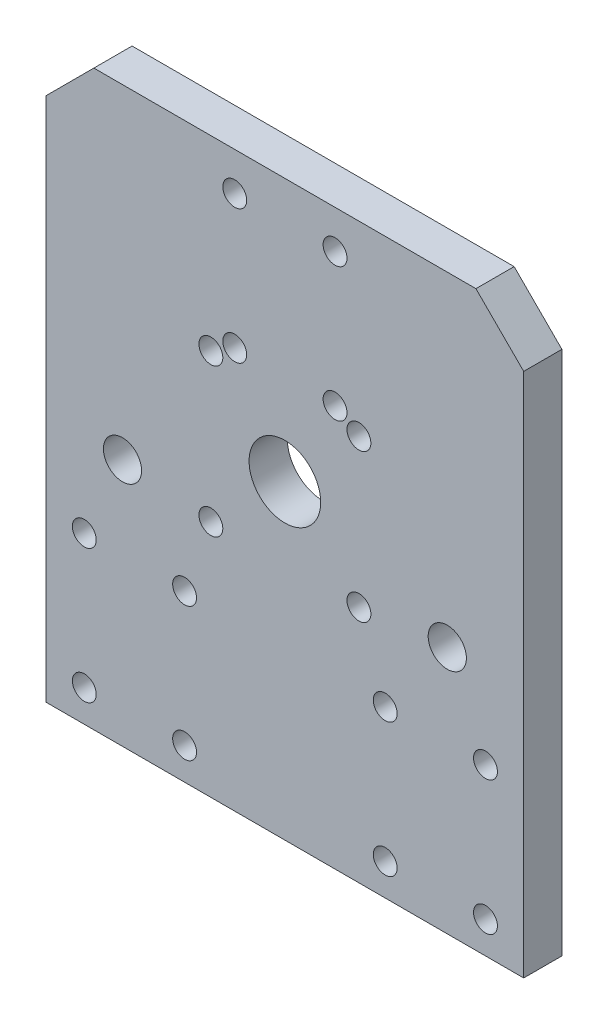
ISO-10303-21;
HEADER;
FILE_DESCRIPTION(('STEP AP214'),'2;1');
FILE_NAME('part.step','',(''),(''),'','','');
FILE_SCHEMA(('AUTOMOTIVE_DESIGN { 1 0 10303 214 1 1 1 1 }'));
ENDSEC;
DATA;
#1=APPLICATION_CONTEXT('core data for automotive mechanical design processes');
#2=APPLICATION_PROTOCOL_DEFINITION('international standard','automotive_design',2000,#1);
#3=PRODUCT_CONTEXT('',#1,'mechanical');
#4=PRODUCT('Part','Part','',(#3));
#5=PRODUCT_RELATED_PRODUCT_CATEGORY('part','',(#4));
#6=PRODUCT_DEFINITION_FORMATION('','',#4);
#7=PRODUCT_DEFINITION_CONTEXT('part definition',#1,'design');
#8=PRODUCT_DEFINITION('design','',#6,#7);
#9=PRODUCT_DEFINITION_SHAPE('','',#8);
#10=(LENGTH_UNIT() NAMED_UNIT(*) SI_UNIT(.MILLI.,.METRE.));
#11=(NAMED_UNIT(*) PLANE_ANGLE_UNIT() SI_UNIT($,.RADIAN.));
#12=(NAMED_UNIT(*) SI_UNIT($,.STERADIAN.) SOLID_ANGLE_UNIT());
#13=UNCERTAINTY_MEASURE_WITH_UNIT(LENGTH_MEASURE(1.E-05),#10,'distance_accuracy_value','');
#14=(GEOMETRIC_REPRESENTATION_CONTEXT(3) GLOBAL_UNCERTAINTY_ASSIGNED_CONTEXT((#13)) GLOBAL_UNIT_ASSIGNED_CONTEXT((#10,
#11,#12)) REPRESENTATION_CONTEXT('',''));
#15=CARTESIAN_POINT('',(0.,0.,0.));
#16=DIRECTION('',(0.,0.,1.));
#17=DIRECTION('',(1.,0.,0.));
#18=AXIS2_PLACEMENT_3D('',#15,#16,#17);
#19=CARTESIAN_POINT('',(0.,0.,4.));
#20=DIRECTION('',(0.,0.,-1.));
#21=DIRECTION('',(-1.,0.,0.));
#22=AXIS2_PLACEMENT_3D('',#19,#20,#21);
#23=PLANE('',#22);
#24=CARTESIAN_POINT('',(34.,51.98,4.));
#25=DIRECTION('',(0.,0.,1.));
#26=DIRECTION('',(1.,0.,0.));
#27=AXIS2_PLACEMENT_3D('',#24,#25,#26);
#28=CIRCLE('',#27,4.);
#29=CARTESIAN_POINT('',(38.,51.98,4.));
#30=VERTEX_POINT('',#29);
#31=EDGE_CURVE('E294',#30,#30,#28,.T.);
#32=ORIENTED_EDGE('',*,*,#31,.F.);
#33=EDGE_LOOP('',(#32));
#34=FACE_BOUND('',#33,.T.);
#35=CARTESIAN_POINT('',(-15.5,49.98,4.));
#36=DIRECTION('',(0.,0.,1.));
#37=DIRECTION('',(1.,0.,0.));
#38=AXIS2_PLACEMENT_3D('',#35,#36,#37);
#39=CIRCLE('',#38,2.5);
#40=CARTESIAN_POINT('',(-13.,49.98,4.));
#41=VERTEX_POINT('',#40);
#42=EDGE_CURVE('E286',#41,#41,#39,.T.);
#43=ORIENTED_EDGE('',*,*,#42,.F.);
#44=EDGE_LOOP('',(#43));
#45=FACE_BOUND('',#44,.T.);
#46=CARTESIAN_POINT('',(15.5,80.98,4.));
#47=DIRECTION('',(0.,0.,1.));
#48=DIRECTION('',(1.,0.,0.));
#49=AXIS2_PLACEMENT_3D('',#46,#47,#48);
#50=CIRCLE('',#49,2.5);
#51=CARTESIAN_POINT('',(18.,80.98,4.));
#52=VERTEX_POINT('',#51);
#53=EDGE_CURVE('E303',#52,#52,#50,.T.);
#54=ORIENTED_EDGE('',*,*,#53,.F.);
#55=EDGE_LOOP('',(#54));
#56=FACE_BOUND('',#55,.T.);
#57=CARTESIAN_POINT('',(15.5,49.98,4.));
#58=DIRECTION('',(0.,0.,1.));
#59=DIRECTION('',(1.,0.,0.));
#60=AXIS2_PLACEMENT_3D('',#57,#58,#59);
#61=CIRCLE('',#60,2.5);
#62=CARTESIAN_POINT('',(18.,49.98,4.));
#63=VERTEX_POINT('',#62);
#64=EDGE_CURVE('E304',#63,#63,#61,.T.);
#65=ORIENTED_EDGE('',*,*,#64,.F.);
#66=EDGE_LOOP('',(#65));
#67=FACE_BOUND('',#66,.T.);
#68=CARTESIAN_POINT('',(-34.,51.98,4.));
#69=DIRECTION('',(0.,0.,1.));
#70=DIRECTION('',(1.,0.,0.));
#71=AXIS2_PLACEMENT_3D('',#68,#69,#70);
#72=CIRCLE('',#71,4.);
#73=CARTESIAN_POINT('',(-30.,51.98,4.));
#74=VERTEX_POINT('',#73);
#75=EDGE_CURVE('E318',#74,#74,#72,.T.);
#76=ORIENTED_EDGE('',*,*,#75,.F.);
#77=EDGE_LOOP('',(#76));
#78=FACE_BOUND('',#77,.T.);
#79=CARTESIAN_POINT('',(-15.5,80.98,4.));
#80=DIRECTION('',(0.,0.,1.));
#81=DIRECTION('',(1.,0.,0.));
#82=AXIS2_PLACEMENT_3D('',#79,#80,#81);
#83=CIRCLE('',#82,2.5);
#84=CARTESIAN_POINT('',(-13.,80.98,4.));
#85=VERTEX_POINT('',#84);
#86=EDGE_CURVE('E282',#85,#85,#83,.T.);
#87=ORIENTED_EDGE('',*,*,#86,.F.);
#88=EDGE_LOOP('',(#87));
#89=FACE_BOUND('',#88,.T.);
#90=DIRECTION('',(0.,1.,0.));
#91=VECTOR('',#90,1.);
#92=CARTESIAN_POINT('',(50.,0.,4.));
#93=LINE('',#92,#91);
#94=CARTESIAN_POINT('',(50.,0.,4.));
#95=VERTEX_POINT('',#94);
#96=CARTESIAN_POINT('',(50.,110.,4.));
#97=VERTEX_POINT('',#96);
#98=EDGE_CURVE('E118',#95,#97,#93,.T.);
#99=ORIENTED_EDGE('',*,*,#98,.T.);
#100=DIRECTION('',(0.707106781186546,-0.707106781186549,0.));
#101=VECTOR('',#100,1.);
#102=CARTESIAN_POINT('',(40.,120.,4.));
#103=LINE('',#102,#101);
#104=CARTESIAN_POINT('',(40.,120.,4.));
#105=VERTEX_POINT('',#104);
#106=EDGE_CURVE('E55',#97,#105,#103,.F.);
#107=ORIENTED_EDGE('',*,*,#106,.T.);
#108=DIRECTION('',(-1.,0.,0.));
#109=VECTOR('',#108,1.);
#110=CARTESIAN_POINT('',(-50.,120.,4.));
#111=LINE('',#110,#109);
#112=CARTESIAN_POINT('',(-40.,120.,4.));
#113=VERTEX_POINT('',#112);
#114=EDGE_CURVE('E131',#105,#113,#111,.T.);
#115=ORIENTED_EDGE('',*,*,#114,.T.);
#116=DIRECTION('',(0.707106781186549,0.707106781186547,0.));
#117=VECTOR('',#116,1.);
#118=CARTESIAN_POINT('',(-50.,110.,4.));
#119=LINE('',#118,#117);
#120=CARTESIAN_POINT('',(-50.,110.,4.));
#121=VERTEX_POINT('',#120);
#122=EDGE_CURVE('E62',#113,#121,#119,.F.);
#123=ORIENTED_EDGE('',*,*,#122,.T.);
#124=DIRECTION('',(0.,-1.,0.));
#125=VECTOR('',#124,1.);
#126=CARTESIAN_POINT('',(-50.,0.,4.));
#127=LINE('',#126,#125);
#128=CARTESIAN_POINT('',(-50.,0.,4.));
#129=VERTEX_POINT('',#128);
#130=EDGE_CURVE('E100',#121,#129,#127,.T.);
#131=ORIENTED_EDGE('',*,*,#130,.T.);
#132=DIRECTION('',(1.,0.,0.));
#133=VECTOR('',#132,1.);
#134=CARTESIAN_POINT('',(50.,0.,4.));
#135=LINE('',#134,#133);
#136=EDGE_CURVE('E103',#129,#95,#135,.T.);
#137=ORIENTED_EDGE('',*,*,#136,.T.);
#138=EDGE_LOOP('',(#99,#107,#115,#123,#131,#137));
#139=FACE_BOUND('',#138,.T.);
#140=CARTESIAN_POINT('',(-42.,6.66986634029465,4.));
#141=DIRECTION('',(0.,0.,1.));
#142=DIRECTION('',(1.,0.,0.));
#143=AXIS2_PLACEMENT_3D('',#140,#141,#142);
#144=CIRCLE('',#143,2.5);
#145=CARTESIAN_POINT('',(-39.5,6.66986634029465,4.));
#146=VERTEX_POINT('',#145);
#147=EDGE_CURVE('E174',#146,#146,#144,.T.);
#148=ORIENTED_EDGE('',*,*,#147,.F.);
#149=EDGE_LOOP('',(#148));
#150=FACE_BOUND('',#149,.T.);
#151=CARTESIAN_POINT('',(-21.,6.66986634029465,4.));
#152=DIRECTION('',(0.,0.,1.));
#153=DIRECTION('',(1.,0.,0.));
#154=AXIS2_PLACEMENT_3D('',#151,#152,#153);
#155=CIRCLE('',#154,2.5);
#156=CARTESIAN_POINT('',(-18.5,6.66986634029465,4.));
#157=VERTEX_POINT('',#156);
#158=EDGE_CURVE('E182',#157,#157,#155,.T.);
#159=ORIENTED_EDGE('',*,*,#158,.F.);
#160=EDGE_LOOP('',(#159));
#161=FACE_BOUND('',#160,.T.);
#162=CARTESIAN_POINT('',(-42.,34.6698663402946,4.));
#163=DIRECTION('',(0.,0.,1.));
#164=DIRECTION('',(1.,0.,0.));
#165=AXIS2_PLACEMENT_3D('',#162,#163,#164);
#166=CIRCLE('',#165,2.5);
#167=CARTESIAN_POINT('',(-39.5,34.6698663402946,4.));
#168=VERTEX_POINT('',#167);
#169=EDGE_CURVE('E190',#168,#168,#166,.T.);
#170=ORIENTED_EDGE('',*,*,#169,.F.);
#171=EDGE_LOOP('',(#170));
#172=FACE_BOUND('',#171,.T.);
#173=CARTESIAN_POINT('',(-21.,34.6698663402946,4.));
#174=DIRECTION('',(0.,0.,1.));
#175=DIRECTION('',(1.,0.,0.));
#176=AXIS2_PLACEMENT_3D('',#173,#174,#175);
#177=CIRCLE('',#176,2.5);
#178=CARTESIAN_POINT('',(-18.5,34.6698663402946,4.));
#179=VERTEX_POINT('',#178);
#180=EDGE_CURVE('E198',#179,#179,#177,.T.);
#181=ORIENTED_EDGE('',*,*,#180,.F.);
#182=EDGE_LOOP('',(#181));
#183=FACE_BOUND('',#182,.T.);
#184=CARTESIAN_POINT('',(-10.5,112.,4.));
#185=DIRECTION('',(0.,0.,1.));
#186=DIRECTION('',(1.,0.,0.));
#187=AXIS2_PLACEMENT_3D('',#184,#185,#186);
#188=CIRCLE('',#187,2.5);
#189=CARTESIAN_POINT('',(-8.00000000000001,112.,4.));
#190=VERTEX_POINT('',#189);
#191=EDGE_CURVE('E206',#190,#190,#188,.T.);
#192=ORIENTED_EDGE('',*,*,#191,.F.);
#193=EDGE_LOOP('',(#192));
#194=FACE_BOUND('',#193,.T.);
#195=CARTESIAN_POINT('',(-10.5,84.,4.));
#196=DIRECTION('',(0.,0.,1.));
#197=DIRECTION('',(1.,0.,0.));
#198=AXIS2_PLACEMENT_3D('',#195,#196,#197);
#199=CIRCLE('',#198,2.5);
#200=CARTESIAN_POINT('',(-8.00000000000001,84.,4.));
#201=VERTEX_POINT('',#200);
#202=EDGE_CURVE('E214',#201,#201,#199,.T.);
#203=ORIENTED_EDGE('',*,*,#202,.F.);
#204=EDGE_LOOP('',(#203));
#205=FACE_BOUND('',#204,.T.);
#206=CARTESIAN_POINT('',(10.5,84.,4.));
#207=DIRECTION('',(0.,0.,1.));
#208=DIRECTION('',(-1.,0.,0.));
#209=AXIS2_PLACEMENT_3D('',#206,#207,#208);
#210=CIRCLE('',#209,2.5);
#211=CARTESIAN_POINT('',(8.00000000000001,84.,4.));
#212=VERTEX_POINT('',#211);
#213=EDGE_CURVE('E222',#212,#212,#210,.T.);
#214=ORIENTED_EDGE('',*,*,#213,.F.);
#215=EDGE_LOOP('',(#214));
#216=FACE_BOUND('',#215,.T.);
#217=CARTESIAN_POINT('',(10.5,112.,4.));
#218=DIRECTION('',(0.,0.,1.));
#219=DIRECTION('',(-1.,0.,0.));
#220=AXIS2_PLACEMENT_3D('',#217,#218,#219);
#221=CIRCLE('',#220,2.5);
#222=CARTESIAN_POINT('',(8.00000000000001,112.,4.));
#223=VERTEX_POINT('',#222);
#224=EDGE_CURVE('E230',#223,#223,#221,.T.);
#225=ORIENTED_EDGE('',*,*,#224,.F.);
#226=EDGE_LOOP('',(#225));
#227=FACE_BOUND('',#226,.T.);
#228=CARTESIAN_POINT('',(21.,34.6698663402946,4.));
#229=DIRECTION('',(0.,0.,1.));
#230=DIRECTION('',(-1.,0.,0.));
#231=AXIS2_PLACEMENT_3D('',#228,#229,#230);
#232=CIRCLE('',#231,2.5);
#233=CARTESIAN_POINT('',(18.5,34.6698663402946,4.));
#234=VERTEX_POINT('',#233);
#235=EDGE_CURVE('E238',#234,#234,#232,.T.);
#236=ORIENTED_EDGE('',*,*,#235,.F.);
#237=EDGE_LOOP('',(#236));
#238=FACE_BOUND('',#237,.T.);
#239=CARTESIAN_POINT('',(42.,34.6698663402946,4.));
#240=DIRECTION('',(0.,0.,1.));
#241=DIRECTION('',(-1.,0.,0.));
#242=AXIS2_PLACEMENT_3D('',#239,#240,#241);
#243=CIRCLE('',#242,2.5);
#244=CARTESIAN_POINT('',(39.5,34.6698663402946,4.));
#245=VERTEX_POINT('',#244);
#246=EDGE_CURVE('E246',#245,#245,#243,.T.);
#247=ORIENTED_EDGE('',*,*,#246,.F.);
#248=EDGE_LOOP('',(#247));
#249=FACE_BOUND('',#248,.T.);
#250=CARTESIAN_POINT('',(21.,6.66986634029465,4.));
#251=DIRECTION('',(0.,0.,1.));
#252=DIRECTION('',(-1.,0.,0.));
#253=AXIS2_PLACEMENT_3D('',#250,#251,#252);
#254=CIRCLE('',#253,2.5);
#255=CARTESIAN_POINT('',(18.5,6.66986634029465,4.));
#256=VERTEX_POINT('',#255);
#257=EDGE_CURVE('E254',#256,#256,#254,.T.);
#258=ORIENTED_EDGE('',*,*,#257,.F.);
#259=EDGE_LOOP('',(#258));
#260=FACE_BOUND('',#259,.T.);
#261=CARTESIAN_POINT('',(42.,6.66986634029465,4.));
#262=DIRECTION('',(0.,0.,1.));
#263=DIRECTION('',(-1.,0.,0.));
#264=AXIS2_PLACEMENT_3D('',#261,#262,#263);
#265=CIRCLE('',#264,2.5);
#266=CARTESIAN_POINT('',(39.5,6.66986634029465,4.));
#267=VERTEX_POINT('',#266);
#268=EDGE_CURVE('E262',#267,#267,#265,.T.);
#269=ORIENTED_EDGE('',*,*,#268,.F.);
#270=EDGE_LOOP('',(#269));
#271=FACE_BOUND('',#270,.T.);
#272=CARTESIAN_POINT('',(0.,64.9999999999999,4.));
#273=DIRECTION('',(0.,0.,1.));
#274=DIRECTION('',(1.,0.,0.));
#275=AXIS2_PLACEMENT_3D('',#272,#273,#274);
#276=CIRCLE('',#275,7.50000000000001);
#277=CARTESIAN_POINT('',(7.50000000000001,64.9999999999999,4.));
#278=VERTEX_POINT('',#277);
#279=EDGE_CURVE('E270',#278,#278,#276,.T.);
#280=ORIENTED_EDGE('',*,*,#279,.F.);
#281=EDGE_LOOP('',(#280));
#282=FACE_BOUND('',#281,.T.);
#283=ADVANCED_FACE('F45',(#34,#45,#56,#67,#78,#89,#139,#150,#161,#172,#183,#194,#205,#216,#227,
#238,#249,#260,#271,#282),#23,.F.);
#284=CARTESIAN_POINT('',(0.,0.,-4.));
#285=DIRECTION('',(0.,0.,-1.));
#286=DIRECTION('',(-1.,0.,0.));
#287=AXIS2_PLACEMENT_3D('',#284,#285,#286);
#288=PLANE('',#287);
#289=CARTESIAN_POINT('',(34.,51.98,-4.));
#290=DIRECTION('',(0.,0.,1.));
#291=DIRECTION('',(1.,0.,0.));
#292=AXIS2_PLACEMENT_3D('',#289,#290,#291);
#293=CIRCLE('',#292,4.);
#294=CARTESIAN_POINT('',(38.,51.98,-4.));
#295=VERTEX_POINT('',#294);
#296=EDGE_CURVE('E290',#295,#295,#293,.T.);
#297=ORIENTED_EDGE('',*,*,#296,.T.);
#298=EDGE_LOOP('',(#297));
#299=FACE_BOUND('',#298,.T.);
#300=CARTESIAN_POINT('',(-15.5,49.98,-4.));
#301=DIRECTION('',(0.,0.,1.));
#302=DIRECTION('',(1.,0.,0.));
#303=AXIS2_PLACEMENT_3D('',#300,#301,#302);
#304=CIRCLE('',#303,2.5);
#305=CARTESIAN_POINT('',(-13.,49.98,-4.));
#306=VERTEX_POINT('',#305);
#307=EDGE_CURVE('E308',#306,#306,#304,.T.);
#308=ORIENTED_EDGE('',*,*,#307,.T.);
#309=EDGE_LOOP('',(#308));
#310=FACE_BOUND('',#309,.T.);
#311=CARTESIAN_POINT('',(15.5,80.98,-4.));
#312=DIRECTION('',(0.,0.,1.));
#313=DIRECTION('',(1.,0.,0.));
#314=AXIS2_PLACEMENT_3D('',#311,#312,#313);
#315=CIRCLE('',#314,2.5);
#316=CARTESIAN_POINT('',(18.,80.98,-4.));
#317=VERTEX_POINT('',#316);
#318=EDGE_CURVE('E299',#317,#317,#315,.T.);
#319=ORIENTED_EDGE('',*,*,#318,.T.);
#320=EDGE_LOOP('',(#319));
#321=FACE_BOUND('',#320,.T.);
#322=CARTESIAN_POINT('',(15.5,49.98,-4.));
#323=DIRECTION('',(0.,0.,1.));
#324=DIRECTION('',(1.,0.,0.));
#325=AXIS2_PLACEMENT_3D('',#322,#323,#324);
#326=CIRCLE('',#325,2.5);
#327=CARTESIAN_POINT('',(18.,49.98,-4.));
#328=VERTEX_POINT('',#327);
#329=EDGE_CURVE('E322',#328,#328,#326,.T.);
#330=ORIENTED_EDGE('',*,*,#329,.T.);
#331=EDGE_LOOP('',(#330));
#332=FACE_BOUND('',#331,.T.);
#333=CARTESIAN_POINT('',(-34.,51.98,-4.));
#334=DIRECTION('',(0.,0.,1.));
#335=DIRECTION('',(1.,0.,0.));
#336=AXIS2_PLACEMENT_3D('',#333,#334,#335);
#337=CIRCLE('',#336,4.);
#338=CARTESIAN_POINT('',(-30.,51.98,-4.));
#339=VERTEX_POINT('',#338);
#340=EDGE_CURVE('E298',#339,#339,#337,.T.);
#341=ORIENTED_EDGE('',*,*,#340,.T.);
#342=EDGE_LOOP('',(#341));
#343=FACE_BOUND('',#342,.T.);
#344=CARTESIAN_POINT('',(-15.5,80.98,-4.));
#345=DIRECTION('',(0.,0.,1.));
#346=DIRECTION('',(1.,0.,0.));
#347=AXIS2_PLACEMENT_3D('',#344,#345,#346);
#348=CIRCLE('',#347,2.5);
#349=CARTESIAN_POINT('',(-13.,80.98,-4.));
#350=VERTEX_POINT('',#349);
#351=EDGE_CURVE('E278',#350,#350,#348,.T.);
#352=ORIENTED_EDGE('',*,*,#351,.T.);
#353=EDGE_LOOP('',(#352));
#354=FACE_BOUND('',#353,.T.);
#355=CARTESIAN_POINT('',(42.,6.66986634029465,-4.));
#356=DIRECTION('',(0.,0.,1.));
#357=DIRECTION('',(-1.,0.,0.));
#358=AXIS2_PLACEMENT_3D('',#355,#356,#357);
#359=CIRCLE('',#358,2.5);
#360=CARTESIAN_POINT('',(39.5,6.66986634029465,-4.));
#361=VERTEX_POINT('',#360);
#362=EDGE_CURVE('E266',#361,#361,#359,.T.);
#363=ORIENTED_EDGE('',*,*,#362,.T.);
#364=EDGE_LOOP('',(#363));
#365=FACE_BOUND('',#364,.T.);
#366=CARTESIAN_POINT('',(42.,34.6698663402946,-4.));
#367=DIRECTION('',(0.,0.,1.));
#368=DIRECTION('',(-1.,0.,0.));
#369=AXIS2_PLACEMENT_3D('',#366,#367,#368);
#370=CIRCLE('',#369,2.5);
#371=CARTESIAN_POINT('',(39.5,34.6698663402946,-4.));
#372=VERTEX_POINT('',#371);
#373=EDGE_CURVE('E250',#372,#372,#370,.T.);
#374=ORIENTED_EDGE('',*,*,#373,.T.);
#375=EDGE_LOOP('',(#374));
#376=FACE_BOUND('',#375,.T.);
#377=CARTESIAN_POINT('',(10.5,112.,-4.));
#378=DIRECTION('',(0.,0.,1.));
#379=DIRECTION('',(-1.,0.,0.));
#380=AXIS2_PLACEMENT_3D('',#377,#378,#379);
#381=CIRCLE('',#380,2.5);
#382=CARTESIAN_POINT('',(8.00000000000001,112.,-4.));
#383=VERTEX_POINT('',#382);
#384=EDGE_CURVE('E234',#383,#383,#381,.T.);
#385=ORIENTED_EDGE('',*,*,#384,.T.);
#386=EDGE_LOOP('',(#385));
#387=FACE_BOUND('',#386,.T.);
#388=CARTESIAN_POINT('',(-10.5,84.,-4.));
#389=DIRECTION('',(0.,0.,1.));
#390=DIRECTION('',(1.,0.,0.));
#391=AXIS2_PLACEMENT_3D('',#388,#389,#390);
#392=CIRCLE('',#391,2.5);
#393=CARTESIAN_POINT('',(-8.00000000000001,84.,-4.));
#394=VERTEX_POINT('',#393);
#395=EDGE_CURVE('E218',#394,#394,#392,.T.);
#396=ORIENTED_EDGE('',*,*,#395,.T.);
#397=EDGE_LOOP('',(#396));
#398=FACE_BOUND('',#397,.T.);
#399=CARTESIAN_POINT('',(-21.,34.6698663402946,-4.));
#400=DIRECTION('',(0.,0.,1.));
#401=DIRECTION('',(1.,0.,0.));
#402=AXIS2_PLACEMENT_3D('',#399,#400,#401);
#403=CIRCLE('',#402,2.5);
#404=CARTESIAN_POINT('',(-18.5,34.6698663402946,-4.));
#405=VERTEX_POINT('',#404);
#406=EDGE_CURVE('E202',#405,#405,#403,.T.);
#407=ORIENTED_EDGE('',*,*,#406,.T.);
#408=EDGE_LOOP('',(#407));
#409=FACE_BOUND('',#408,.T.);
#410=CARTESIAN_POINT('',(-21.,6.66986634029465,-4.));
#411=DIRECTION('',(0.,0.,1.));
#412=DIRECTION('',(1.,0.,0.));
#413=AXIS2_PLACEMENT_3D('',#410,#411,#412);
#414=CIRCLE('',#413,2.5);
#415=CARTESIAN_POINT('',(-18.5,6.66986634029465,-4.));
#416=VERTEX_POINT('',#415);
#417=EDGE_CURVE('E186',#416,#416,#414,.T.);
#418=ORIENTED_EDGE('',*,*,#417,.T.);
#419=EDGE_LOOP('',(#418));
#420=FACE_BOUND('',#419,.T.);
#421=DIRECTION('',(-1.,0.,0.));
#422=VECTOR('',#421,1.);
#423=CARTESIAN_POINT('',(-50.,120.,-4.));
#424=LINE('',#423,#422);
#425=CARTESIAN_POINT('',(40.,120.,-4.));
#426=VERTEX_POINT('',#425);
#427=CARTESIAN_POINT('',(-40.,120.,-4.));
#428=VERTEX_POINT('',#427);
#429=EDGE_CURVE('E109',#426,#428,#424,.T.);
#430=ORIENTED_EDGE('',*,*,#429,.F.);
#431=DIRECTION('',(-0.707106781186546,0.707106781186549,0.));
#432=VECTOR('',#431,1.);
#433=CARTESIAN_POINT('',(80.0000000000001,79.9999999999997,-4.));
#434=LINE('',#433,#432);
#435=CARTESIAN_POINT('',(50.,110.,-4.));
#436=VERTEX_POINT('',#435);
#437=EDGE_CURVE('E141',#426,#436,#434,.F.);
#438=ORIENTED_EDGE('',*,*,#437,.T.);
#439=DIRECTION('',(0.,1.,0.));
#440=VECTOR('',#439,1.);
#441=CARTESIAN_POINT('',(50.,0.,-4.));
#442=LINE('',#441,#440);
#443=CARTESIAN_POINT('',(50.,0.,-4.));
#444=VERTEX_POINT('',#443);
#445=EDGE_CURVE('E164',#444,#436,#442,.T.);
#446=ORIENTED_EDGE('',*,*,#445,.F.);
#447=DIRECTION('',(1.,0.,0.));
#448=VECTOR('',#447,1.);
#449=CARTESIAN_POINT('',(50.,0.,-4.));
#450=LINE('',#449,#448);
#451=CARTESIAN_POINT('',(-50.,0.,-4.));
#452=VERTEX_POINT('',#451);
#453=EDGE_CURVE('E167',#452,#444,#450,.T.);
#454=ORIENTED_EDGE('',*,*,#453,.F.);
#455=DIRECTION('',(0.,-1.,0.));
#456=VECTOR('',#455,1.);
#457=CARTESIAN_POINT('',(-50.,0.,-4.));
#458=LINE('',#457,#456);
#459=CARTESIAN_POINT('',(-50.,110.,-4.));
#460=VERTEX_POINT('',#459);
#461=EDGE_CURVE('E122',#460,#452,#458,.T.);
#462=ORIENTED_EDGE('',*,*,#461,.F.);
#463=DIRECTION('',(-0.707106781186549,-0.707106781186547,0.));
#464=VECTOR('',#463,1.);
#465=CARTESIAN_POINT('',(-79.9999999999999,80.0000000000002,-4.));
#466=LINE('',#465,#464);
#467=EDGE_CURVE('E138',#460,#428,#466,.F.);
#468=ORIENTED_EDGE('',*,*,#467,.T.);
#469=EDGE_LOOP('',(#430,#438,#446,#454,#462,#468));
#470=FACE_BOUND('',#469,.T.);
#471=CARTESIAN_POINT('',(-42.,6.66986634029465,-4.));
#472=DIRECTION('',(0.,0.,1.));
#473=DIRECTION('',(1.,0.,0.));
#474=AXIS2_PLACEMENT_3D('',#471,#472,#473);
#475=CIRCLE('',#474,2.5);
#476=CARTESIAN_POINT('',(-39.5,6.66986634029465,-4.));
#477=VERTEX_POINT('',#476);
#478=EDGE_CURVE('E178',#477,#477,#475,.T.);
#479=ORIENTED_EDGE('',*,*,#478,.T.);
#480=EDGE_LOOP('',(#479));
#481=FACE_BOUND('',#480,.T.);
#482=CARTESIAN_POINT('',(-42.,34.6698663402946,-4.));
#483=DIRECTION('',(0.,0.,1.));
#484=DIRECTION('',(1.,0.,0.));
#485=AXIS2_PLACEMENT_3D('',#482,#483,#484);
#486=CIRCLE('',#485,2.5);
#487=CARTESIAN_POINT('',(-39.5,34.6698663402946,-4.));
#488=VERTEX_POINT('',#487);
#489=EDGE_CURVE('E194',#488,#488,#486,.T.);
#490=ORIENTED_EDGE('',*,*,#489,.T.);
#491=EDGE_LOOP('',(#490));
#492=FACE_BOUND('',#491,.T.);
#493=CARTESIAN_POINT('',(-10.5,112.,-4.));
#494=DIRECTION('',(0.,0.,1.));
#495=DIRECTION('',(1.,0.,0.));
#496=AXIS2_PLACEMENT_3D('',#493,#494,#495);
#497=CIRCLE('',#496,2.5);
#498=CARTESIAN_POINT('',(-8.00000000000001,112.,-4.));
#499=VERTEX_POINT('',#498);
#500=EDGE_CURVE('E210',#499,#499,#497,.T.);
#501=ORIENTED_EDGE('',*,*,#500,.T.);
#502=EDGE_LOOP('',(#501));
#503=FACE_BOUND('',#502,.T.);
#504=CARTESIAN_POINT('',(10.5,84.,-4.));
#505=DIRECTION('',(0.,0.,1.));
#506=DIRECTION('',(-1.,0.,0.));
#507=AXIS2_PLACEMENT_3D('',#504,#505,#506);
#508=CIRCLE('',#507,2.5);
#509=CARTESIAN_POINT('',(8.00000000000001,84.,-4.));
#510=VERTEX_POINT('',#509);
#511=EDGE_CURVE('E226',#510,#510,#508,.T.);
#512=ORIENTED_EDGE('',*,*,#511,.T.);
#513=EDGE_LOOP('',(#512));
#514=FACE_BOUND('',#513,.T.);
#515=CARTESIAN_POINT('',(21.,34.6698663402946,-4.));
#516=DIRECTION('',(0.,0.,1.));
#517=DIRECTION('',(-1.,0.,0.));
#518=AXIS2_PLACEMENT_3D('',#515,#516,#517);
#519=CIRCLE('',#518,2.5);
#520=CARTESIAN_POINT('',(18.5,34.6698663402946,-4.));
#521=VERTEX_POINT('',#520);
#522=EDGE_CURVE('E242',#521,#521,#519,.T.);
#523=ORIENTED_EDGE('',*,*,#522,.T.);
#524=EDGE_LOOP('',(#523));
#525=FACE_BOUND('',#524,.T.);
#526=CARTESIAN_POINT('',(21.,6.66986634029465,-4.));
#527=DIRECTION('',(0.,0.,1.));
#528=DIRECTION('',(-1.,0.,0.));
#529=AXIS2_PLACEMENT_3D('',#526,#527,#528);
#530=CIRCLE('',#529,2.5);
#531=CARTESIAN_POINT('',(18.5,6.66986634029465,-4.));
#532=VERTEX_POINT('',#531);
#533=EDGE_CURVE('E258',#532,#532,#530,.T.);
#534=ORIENTED_EDGE('',*,*,#533,.T.);
#535=EDGE_LOOP('',(#534));
#536=FACE_BOUND('',#535,.T.);
#537=CARTESIAN_POINT('',(0.,64.9999999999999,-4.));
#538=DIRECTION('',(0.,0.,1.));
#539=DIRECTION('',(1.,0.,0.));
#540=AXIS2_PLACEMENT_3D('',#537,#538,#539);
#541=CIRCLE('',#540,7.50000000000001);
#542=CARTESIAN_POINT('',(7.50000000000001,64.9999999999999,-4.));
#543=VERTEX_POINT('',#542);
#544=EDGE_CURVE('E274',#543,#543,#541,.T.);
#545=ORIENTED_EDGE('',*,*,#544,.T.);
#546=EDGE_LOOP('',(#545));
#547=FACE_BOUND('',#546,.T.);
#548=ADVANCED_FACE('F162',(#299,#310,#321,#332,#343,#354,#365,#376,#387,#398,#409,#420,#470,
#481,#492,#503,#514,#525,#536,#547),#288,.T.);
#549=CARTESIAN_POINT('',(-50.,0.,4.));
#550=DIRECTION('',(1.,0.,0.));
#551=DIRECTION('',(0.,1.,0.));
#552=AXIS2_PLACEMENT_3D('',#549,#550,#551);
#553=PLANE('',#552);
#554=ORIENTED_EDGE('',*,*,#130,.F.);
#555=DIRECTION('',(0.,0.,-1.));
#556=VECTOR('',#555,1.);
#557=CARTESIAN_POINT('',(-50.,110.,4.));
#558=LINE('',#557,#556);
#559=EDGE_CURVE('E11',#121,#460,#558,.T.);
#560=ORIENTED_EDGE('',*,*,#559,.T.);
#561=ORIENTED_EDGE('',*,*,#461,.T.);
#562=DIRECTION('',(0.,0.,-1.));
#563=VECTOR('',#562,1.);
#564=CARTESIAN_POINT('',(-50.,0.,4.));
#565=LINE('',#564,#563);
#566=EDGE_CURVE('E114',#129,#452,#565,.T.);
#567=ORIENTED_EDGE('',*,*,#566,.F.);
#568=EDGE_LOOP('',(#554,#560,#561,#567));
#569=FACE_BOUND('',#568,.T.);
#570=ADVANCED_FACE('F120',(#569),#553,.F.);
#571=CARTESIAN_POINT('',(50.,0.,4.));
#572=DIRECTION('',(0.,1.,0.));
#573=DIRECTION('',(0.,0.,1.));
#574=AXIS2_PLACEMENT_3D('',#571,#572,#573);
#575=PLANE('',#574);
#576=ORIENTED_EDGE('',*,*,#453,.T.);
#577=DIRECTION('',(0.,0.,-1.));
#578=VECTOR('',#577,1.);
#579=CARTESIAN_POINT('',(50.,0.,4.));
#580=LINE('',#579,#578);
#581=EDGE_CURVE('E116',#95,#444,#580,.T.);
#582=ORIENTED_EDGE('',*,*,#581,.F.);
#583=ORIENTED_EDGE('',*,*,#136,.F.);
#584=ORIENTED_EDGE('',*,*,#566,.T.);
#585=EDGE_LOOP('',(#576,#582,#583,#584));
#586=FACE_BOUND('',#585,.T.);
#587=ADVANCED_FACE('F113',(#586),#575,.F.);
#588=CARTESIAN_POINT('',(50.,0.,4.));
#589=DIRECTION('',(-1.,0.,0.));
#590=DIRECTION('',(0.,-1.,0.));
#591=AXIS2_PLACEMENT_3D('',#588,#589,#590);
#592=PLANE('',#591);
#593=ORIENTED_EDGE('',*,*,#445,.T.);
#594=DIRECTION('',(0.,0.,1.));
#595=VECTOR('',#594,1.);
#596=CARTESIAN_POINT('',(50.,110.,4.));
#597=LINE('',#596,#595);
#598=EDGE_CURVE('E70',#436,#97,#597,.T.);
#599=ORIENTED_EDGE('',*,*,#598,.T.);
#600=ORIENTED_EDGE('',*,*,#98,.F.);
#601=ORIENTED_EDGE('',*,*,#581,.T.);
#602=EDGE_LOOP('',(#593,#599,#600,#601));
#603=FACE_BOUND('',#602,.T.);
#604=ADVANCED_FACE('F165',(#603),#592,.F.);
#605=CARTESIAN_POINT('',(-50.,120.,4.));
#606=DIRECTION('',(0.,-1.,0.));
#607=DIRECTION('',(0.,0.,-1.));
#608=AXIS2_PLACEMENT_3D('',#605,#606,#607);
#609=PLANE('',#608);
#610=ORIENTED_EDGE('',*,*,#114,.F.);
#611=DIRECTION('',(0.,0.,-1.));
#612=VECTOR('',#611,1.);
#613=CARTESIAN_POINT('',(40.,120.,4.));
#614=LINE('',#613,#612);
#615=EDGE_CURVE('E129',#105,#426,#614,.T.);
#616=ORIENTED_EDGE('',*,*,#615,.T.);
#617=ORIENTED_EDGE('',*,*,#429,.T.);
#618=DIRECTION('',(0.,0.,1.));
#619=VECTOR('',#618,1.);
#620=CARTESIAN_POINT('',(-40.,120.,4.));
#621=LINE('',#620,#619);
#622=EDGE_CURVE('E125',#428,#113,#621,.T.);
#623=ORIENTED_EDGE('',*,*,#622,.T.);
#624=EDGE_LOOP('',(#610,#616,#617,#623));
#625=FACE_BOUND('',#624,.T.);
#626=ADVANCED_FACE('F153',(#625),#609,.F.);
#627=CARTESIAN_POINT('',(-42.,6.66986634029465,4.));
#628=DIRECTION('',(0.,0.,-1.));
#629=DIRECTION('',(-1.,0.,0.));
#630=AXIS2_PLACEMENT_3D('',#627,#628,#629);
#631=CYLINDRICAL_SURFACE('',#630,2.5);
#632=ORIENTED_EDGE('',*,*,#147,.T.);
#633=EDGE_LOOP('',(#632));
#634=FACE_BOUND('',#633,.T.);
#635=ORIENTED_EDGE('',*,*,#478,.F.);
#636=EDGE_LOOP('',(#635));
#637=FACE_BOUND('',#636,.T.);
#638=ADVANCED_FACE('F404',(#634,#637),#631,.F.);
#639=CARTESIAN_POINT('',(-21.,6.66986634029465,4.));
#640=DIRECTION('',(0.,0.,-1.));
#641=DIRECTION('',(-1.,0.,0.));
#642=AXIS2_PLACEMENT_3D('',#639,#640,#641);
#643=CYLINDRICAL_SURFACE('',#642,2.5);
#644=ORIENTED_EDGE('',*,*,#158,.T.);
#645=EDGE_LOOP('',(#644));
#646=FACE_BOUND('',#645,.T.);
#647=ORIENTED_EDGE('',*,*,#417,.F.);
#648=EDGE_LOOP('',(#647));
#649=FACE_BOUND('',#648,.T.);
#650=ADVANCED_FACE('F400',(#646,#649),#643,.F.);
#651=CARTESIAN_POINT('',(-42.,34.6698663402946,4.));
#652=DIRECTION('',(0.,0.,-1.));
#653=DIRECTION('',(-1.,0.,0.));
#654=AXIS2_PLACEMENT_3D('',#651,#652,#653);
#655=CYLINDRICAL_SURFACE('',#654,2.5);
#656=ORIENTED_EDGE('',*,*,#169,.T.);
#657=EDGE_LOOP('',(#656));
#658=FACE_BOUND('',#657,.T.);
#659=ORIENTED_EDGE('',*,*,#489,.F.);
#660=EDGE_LOOP('',(#659));
#661=FACE_BOUND('',#660,.T.);
#662=ADVANCED_FACE('F396',(#658,#661),#655,.F.);
#663=CARTESIAN_POINT('',(-21.,34.6698663402946,4.));
#664=DIRECTION('',(0.,0.,-1.));
#665=DIRECTION('',(-1.,0.,0.));
#666=AXIS2_PLACEMENT_3D('',#663,#664,#665);
#667=CYLINDRICAL_SURFACE('',#666,2.5);
#668=ORIENTED_EDGE('',*,*,#180,.T.);
#669=EDGE_LOOP('',(#668));
#670=FACE_BOUND('',#669,.T.);
#671=ORIENTED_EDGE('',*,*,#406,.F.);
#672=EDGE_LOOP('',(#671));
#673=FACE_BOUND('',#672,.T.);
#674=ADVANCED_FACE('F392',(#670,#673),#667,.F.);
#675=CARTESIAN_POINT('',(-10.5,112.,4.));
#676=DIRECTION('',(0.,0.,-1.));
#677=DIRECTION('',(-1.,0.,0.));
#678=AXIS2_PLACEMENT_3D('',#675,#676,#677);
#679=CYLINDRICAL_SURFACE('',#678,2.5);
#680=ORIENTED_EDGE('',*,*,#191,.T.);
#681=EDGE_LOOP('',(#680));
#682=FACE_BOUND('',#681,.T.);
#683=ORIENTED_EDGE('',*,*,#500,.F.);
#684=EDGE_LOOP('',(#683));
#685=FACE_BOUND('',#684,.T.);
#686=ADVANCED_FACE('F388',(#682,#685),#679,.F.);
#687=CARTESIAN_POINT('',(-10.5,84.,4.));
#688=DIRECTION('',(0.,0.,-1.));
#689=DIRECTION('',(-1.,0.,0.));
#690=AXIS2_PLACEMENT_3D('',#687,#688,#689);
#691=CYLINDRICAL_SURFACE('',#690,2.5);
#692=ORIENTED_EDGE('',*,*,#202,.T.);
#693=EDGE_LOOP('',(#692));
#694=FACE_BOUND('',#693,.T.);
#695=ORIENTED_EDGE('',*,*,#395,.F.);
#696=EDGE_LOOP('',(#695));
#697=FACE_BOUND('',#696,.T.);
#698=ADVANCED_FACE('F384',(#694,#697),#691,.F.);
#699=CARTESIAN_POINT('',(10.5,84.,4.));
#700=DIRECTION('',(0.,0.,-1.));
#701=DIRECTION('',(-1.,0.,0.));
#702=AXIS2_PLACEMENT_3D('',#699,#700,#701);
#703=CYLINDRICAL_SURFACE('',#702,2.5);
#704=ORIENTED_EDGE('',*,*,#213,.T.);
#705=EDGE_LOOP('',(#704));
#706=FACE_BOUND('',#705,.T.);
#707=ORIENTED_EDGE('',*,*,#511,.F.);
#708=EDGE_LOOP('',(#707));
#709=FACE_BOUND('',#708,.T.);
#710=ADVANCED_FACE('F380',(#706,#709),#703,.F.);
#711=CARTESIAN_POINT('',(10.5,112.,4.));
#712=DIRECTION('',(0.,0.,-1.));
#713=DIRECTION('',(-1.,0.,0.));
#714=AXIS2_PLACEMENT_3D('',#711,#712,#713);
#715=CYLINDRICAL_SURFACE('',#714,2.5);
#716=ORIENTED_EDGE('',*,*,#224,.T.);
#717=EDGE_LOOP('',(#716));
#718=FACE_BOUND('',#717,.T.);
#719=ORIENTED_EDGE('',*,*,#384,.F.);
#720=EDGE_LOOP('',(#719));
#721=FACE_BOUND('',#720,.T.);
#722=ADVANCED_FACE('F376',(#718,#721),#715,.F.);
#723=CARTESIAN_POINT('',(21.,34.6698663402946,4.));
#724=DIRECTION('',(0.,0.,-1.));
#725=DIRECTION('',(-1.,0.,0.));
#726=AXIS2_PLACEMENT_3D('',#723,#724,#725);
#727=CYLINDRICAL_SURFACE('',#726,2.5);
#728=ORIENTED_EDGE('',*,*,#235,.T.);
#729=EDGE_LOOP('',(#728));
#730=FACE_BOUND('',#729,.T.);
#731=ORIENTED_EDGE('',*,*,#522,.F.);
#732=EDGE_LOOP('',(#731));
#733=FACE_BOUND('',#732,.T.);
#734=ADVANCED_FACE('F372',(#730,#733),#727,.F.);
#735=CARTESIAN_POINT('',(42.,34.6698663402946,4.));
#736=DIRECTION('',(0.,0.,-1.));
#737=DIRECTION('',(-1.,0.,0.));
#738=AXIS2_PLACEMENT_3D('',#735,#736,#737);
#739=CYLINDRICAL_SURFACE('',#738,2.5);
#740=ORIENTED_EDGE('',*,*,#246,.T.);
#741=EDGE_LOOP('',(#740));
#742=FACE_BOUND('',#741,.T.);
#743=ORIENTED_EDGE('',*,*,#373,.F.);
#744=EDGE_LOOP('',(#743));
#745=FACE_BOUND('',#744,.T.);
#746=ADVANCED_FACE('F368',(#742,#745),#739,.F.);
#747=CARTESIAN_POINT('',(21.,6.66986634029465,4.));
#748=DIRECTION('',(0.,0.,-1.));
#749=DIRECTION('',(-1.,0.,0.));
#750=AXIS2_PLACEMENT_3D('',#747,#748,#749);
#751=CYLINDRICAL_SURFACE('',#750,2.5);
#752=ORIENTED_EDGE('',*,*,#257,.T.);
#753=EDGE_LOOP('',(#752));
#754=FACE_BOUND('',#753,.T.);
#755=ORIENTED_EDGE('',*,*,#533,.F.);
#756=EDGE_LOOP('',(#755));
#757=FACE_BOUND('',#756,.T.);
#758=ADVANCED_FACE('F364',(#754,#757),#751,.F.);
#759=CARTESIAN_POINT('',(42.,6.66986634029465,4.));
#760=DIRECTION('',(0.,0.,-1.));
#761=DIRECTION('',(-1.,0.,0.));
#762=AXIS2_PLACEMENT_3D('',#759,#760,#761);
#763=CYLINDRICAL_SURFACE('',#762,2.5);
#764=ORIENTED_EDGE('',*,*,#268,.T.);
#765=EDGE_LOOP('',(#764));
#766=FACE_BOUND('',#765,.T.);
#767=ORIENTED_EDGE('',*,*,#362,.F.);
#768=EDGE_LOOP('',(#767));
#769=FACE_BOUND('',#768,.T.);
#770=ADVANCED_FACE('F360',(#766,#769),#763,.F.);
#771=CARTESIAN_POINT('',(0.,64.9999999999999,4.));
#772=DIRECTION('',(0.,0.,-1.));
#773=DIRECTION('',(-1.,0.,0.));
#774=AXIS2_PLACEMENT_3D('',#771,#772,#773);
#775=CYLINDRICAL_SURFACE('',#774,7.50000000000001);
#776=ORIENTED_EDGE('',*,*,#279,.T.);
#777=EDGE_LOOP('',(#776));
#778=FACE_BOUND('',#777,.T.);
#779=ORIENTED_EDGE('',*,*,#544,.F.);
#780=EDGE_LOOP('',(#779));
#781=FACE_BOUND('',#780,.T.);
#782=ADVANCED_FACE('F357',(#778,#781),#775,.F.);
#783=CARTESIAN_POINT('',(40.,120.,4.));
#784=DIRECTION('',(-0.707106781186549,-0.707106781186546,0.));
#785=DIRECTION('',(0.,0.,-1.));
#786=AXIS2_PLACEMENT_3D('',#783,#784,#785);
#787=PLANE('',#786);
#788=ORIENTED_EDGE('',*,*,#106,.F.);
#789=ORIENTED_EDGE('',*,*,#598,.F.);
#790=ORIENTED_EDGE('',*,*,#437,.F.);
#791=ORIENTED_EDGE('',*,*,#615,.F.);
#792=EDGE_LOOP('',(#788,#789,#790,#791));
#793=FACE_BOUND('',#792,.T.);
#794=ADVANCED_FACE('F159',(#793),#787,.F.);
#795=CARTESIAN_POINT('',(-50.,110.,4.));
#796=DIRECTION('',(0.707106781186547,-0.707106781186549,0.));
#797=DIRECTION('',(0.,0.,-1.));
#798=AXIS2_PLACEMENT_3D('',#795,#796,#797);
#799=PLANE('',#798);
#800=ORIENTED_EDGE('',*,*,#122,.F.);
#801=ORIENTED_EDGE('',*,*,#622,.F.);
#802=ORIENTED_EDGE('',*,*,#467,.F.);
#803=ORIENTED_EDGE('',*,*,#559,.F.);
#804=EDGE_LOOP('',(#800,#801,#802,#803));
#805=FACE_BOUND('',#804,.T.);
#806=ADVANCED_FACE('F48',(#805),#799,.F.);
#807=CARTESIAN_POINT('',(-15.5,80.98,-4.));
#808=DIRECTION('',(0.,0.,1.));
#809=DIRECTION('',(1.,0.,0.));
#810=AXIS2_PLACEMENT_3D('',#807,#808,#809);
#811=CYLINDRICAL_SURFACE('',#810,2.5);
#812=ORIENTED_EDGE('',*,*,#351,.F.);
#813=EDGE_LOOP('',(#812));
#814=FACE_BOUND('',#813,.T.);
#815=ORIENTED_EDGE('',*,*,#86,.T.);
#816=EDGE_LOOP('',(#815));
#817=FACE_BOUND('',#816,.T.);
#818=ADVANCED_FACE('F340',(#814,#817),#811,.F.);
#819=CARTESIAN_POINT('',(-34.,51.98,-4.));
#820=DIRECTION('',(0.,0.,1.));
#821=DIRECTION('',(1.,0.,0.));
#822=AXIS2_PLACEMENT_3D('',#819,#820,#821);
#823=CYLINDRICAL_SURFACE('',#822,4.);
#824=ORIENTED_EDGE('',*,*,#340,.F.);
#825=EDGE_LOOP('',(#824));
#826=FACE_BOUND('',#825,.T.);
#827=ORIENTED_EDGE('',*,*,#75,.T.);
#828=EDGE_LOOP('',(#827));
#829=FACE_BOUND('',#828,.T.);
#830=ADVANCED_FACE('F342',(#826,#829),#823,.F.);
#831=CARTESIAN_POINT('',(15.5,49.98,-4.));
#832=DIRECTION('',(0.,0.,1.));
#833=DIRECTION('',(1.,0.,0.));
#834=AXIS2_PLACEMENT_3D('',#831,#832,#833);
#835=CYLINDRICAL_SURFACE('',#834,2.5);
#836=ORIENTED_EDGE('',*,*,#329,.F.);
#837=EDGE_LOOP('',(#836));
#838=FACE_BOUND('',#837,.T.);
#839=ORIENTED_EDGE('',*,*,#64,.T.);
#840=EDGE_LOOP('',(#839));
#841=FACE_BOUND('',#840,.T.);
#842=ADVANCED_FACE('F330',(#838,#841),#835,.F.);
#843=CARTESIAN_POINT('',(15.5,80.98,-4.));
#844=DIRECTION('',(0.,0.,1.));
#845=DIRECTION('',(1.,0.,0.));
#846=AXIS2_PLACEMENT_3D('',#843,#844,#845);
#847=CYLINDRICAL_SURFACE('',#846,2.5);
#848=ORIENTED_EDGE('',*,*,#318,.F.);
#849=EDGE_LOOP('',(#848));
#850=FACE_BOUND('',#849,.T.);
#851=ORIENTED_EDGE('',*,*,#53,.T.);
#852=EDGE_LOOP('',(#851));
#853=FACE_BOUND('',#852,.T.);
#854=ADVANCED_FACE('F469',(#850,#853),#847,.F.);
#855=CARTESIAN_POINT('',(-15.5,49.98,-4.));
#856=DIRECTION('',(0.,0.,1.));
#857=DIRECTION('',(1.,0.,0.));
#858=AXIS2_PLACEMENT_3D('',#855,#856,#857);
#859=CYLINDRICAL_SURFACE('',#858,2.5);
#860=ORIENTED_EDGE('',*,*,#307,.F.);
#861=EDGE_LOOP('',(#860));
#862=FACE_BOUND('',#861,.T.);
#863=ORIENTED_EDGE('',*,*,#42,.T.);
#864=EDGE_LOOP('',(#863));
#865=FACE_BOUND('',#864,.T.);
#866=ADVANCED_FACE('F480',(#862,#865),#859,.F.);
#867=CARTESIAN_POINT('',(34.,51.98,-4.));
#868=DIRECTION('',(0.,0.,1.));
#869=DIRECTION('',(1.,0.,0.));
#870=AXIS2_PLACEMENT_3D('',#867,#868,#869);
#871=CYLINDRICAL_SURFACE('',#870,4.);
#872=ORIENTED_EDGE('',*,*,#296,.F.);
#873=EDGE_LOOP('',(#872));
#874=FACE_BOUND('',#873,.T.);
#875=ORIENTED_EDGE('',*,*,#31,.T.);
#876=EDGE_LOOP('',(#875));
#877=FACE_BOUND('',#876,.T.);
#878=ADVANCED_FACE('F355',(#874,#877),#871,.F.);
#879=CLOSED_SHELL('',(#283,#548,#570,#587,#604,#626,#638,#650,#662,#674,#686,#698,#710,#722,
#734,#746,#758,#770,#782,#794,#806,#818,#830,#842,#854,#866,#878));
#880=MANIFOLD_SOLID_BREP('B2',#879);
#881=ADVANCED_BREP_SHAPE_REPRESENTATION('',(#18,#880),#14);
#882=SHAPE_DEFINITION_REPRESENTATION(#9,#881);
ENDSEC;
END-ISO-10303-21;
